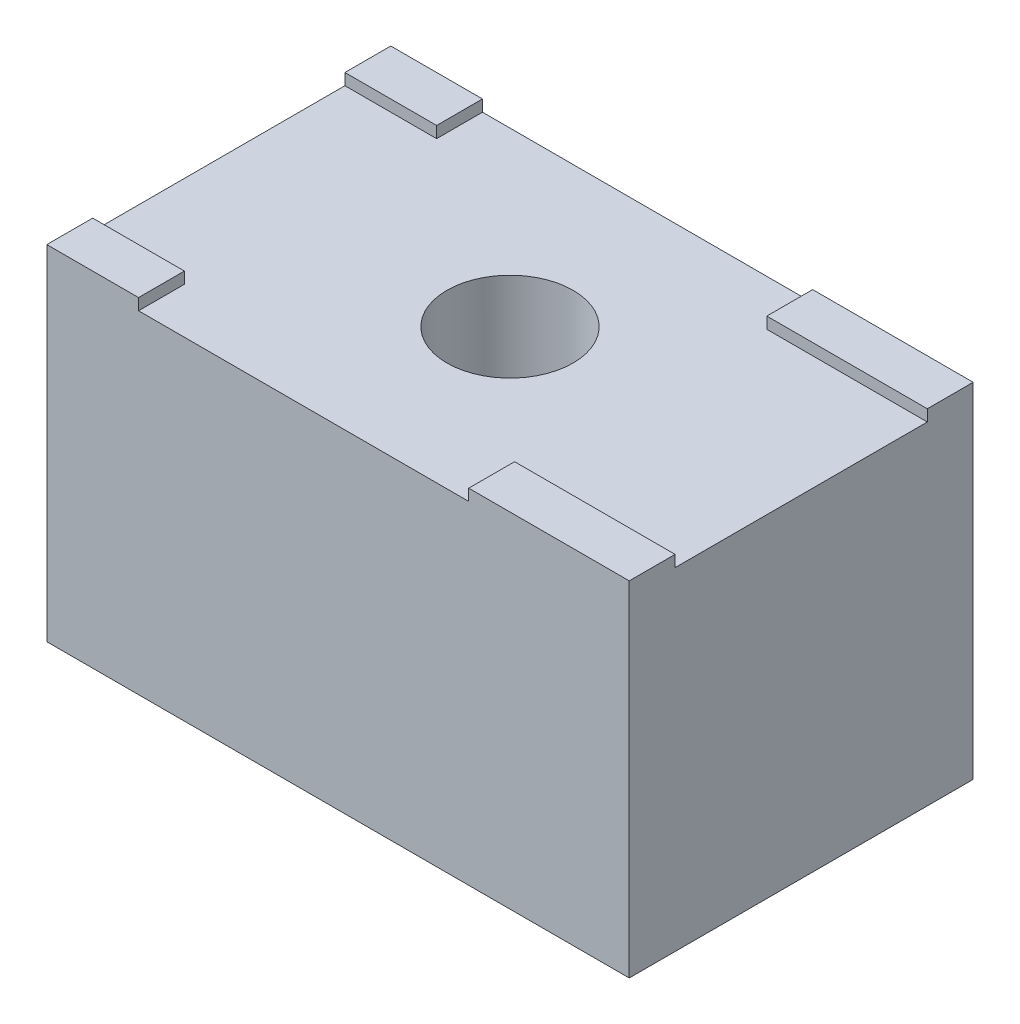
ISO-10303-21;
HEADER;
FILE_DESCRIPTION(('STEP AP214'),'2;1');
FILE_NAME('part.step','',(''),(''),'','','');
FILE_SCHEMA(('AUTOMOTIVE_DESIGN { 1 0 10303 214 1 1 1 1 }'));
ENDSEC;
DATA;
#1=APPLICATION_CONTEXT('core data for automotive mechanical design processes');
#2=APPLICATION_PROTOCOL_DEFINITION('international standard','automotive_design',2000,#1);
#3=PRODUCT_CONTEXT('',#1,'mechanical');
#4=PRODUCT('Part','Part','',(#3));
#5=PRODUCT_RELATED_PRODUCT_CATEGORY('part','',(#4));
#6=PRODUCT_DEFINITION_FORMATION('','',#4);
#7=PRODUCT_DEFINITION_CONTEXT('part definition',#1,'design');
#8=PRODUCT_DEFINITION('design','',#6,#7);
#9=PRODUCT_DEFINITION_SHAPE('','',#8);
#10=(LENGTH_UNIT() NAMED_UNIT(*) SI_UNIT(.MILLI.,.METRE.));
#11=(NAMED_UNIT(*) PLANE_ANGLE_UNIT() SI_UNIT($,.RADIAN.));
#12=(NAMED_UNIT(*) SI_UNIT($,.STERADIAN.) SOLID_ANGLE_UNIT());
#13=UNCERTAINTY_MEASURE_WITH_UNIT(LENGTH_MEASURE(1.E-05),#10,'distance_accuracy_value','');
#14=(GEOMETRIC_REPRESENTATION_CONTEXT(3) GLOBAL_UNCERTAINTY_ASSIGNED_CONTEXT((#13)) GLOBAL_UNIT_ASSIGNED_CONTEXT((#10,
#11,#12)) REPRESENTATION_CONTEXT('',''));
#15=CARTESIAN_POINT('',(0.,0.,0.));
#16=DIRECTION('',(0.,0.,1.));
#17=DIRECTION('',(1.,0.,0.));
#18=AXIS2_PLACEMENT_3D('',#15,#16,#17);
#19=CARTESIAN_POINT('',(25.4,7.5,7.5));
#20=DIRECTION('',(0.,-1.,0.));
#21=DIRECTION('',(0.,0.,-1.));
#22=AXIS2_PLACEMENT_3D('',#19,#20,#21);
#23=PLANE('',#22);
#24=DIRECTION('',(-1.,0.,0.));
#25=VECTOR('',#24,1.);
#26=CARTESIAN_POINT('',(25.4,7.5,-7.5));
#27=LINE('',#26,#25);
#28=CARTESIAN_POINT('',(25.4,7.5,-7.5));
#29=VERTEX_POINT('',#28);
#30=CARTESIAN_POINT('',(18.4,7.5,-7.5));
#31=VERTEX_POINT('',#30);
#32=EDGE_CURVE('E344',#29,#31,#27,.T.);
#33=ORIENTED_EDGE('',*,*,#32,.T.);
#34=DIRECTION('',(0.,0.,-1.));
#35=VECTOR('',#34,1.);
#36=CARTESIAN_POINT('',(18.4,7.5,-7.5));
#37=LINE('',#36,#35);
#38=CARTESIAN_POINT('',(18.4,7.5,-5.5));
#39=VERTEX_POINT('',#38);
#40=EDGE_CURVE('E208',#39,#31,#37,.T.);
#41=ORIENTED_EDGE('',*,*,#40,.F.);
#42=DIRECTION('',(-1.,0.,0.));
#43=VECTOR('',#42,1.);
#44=CARTESIAN_POINT('',(18.4,7.5,-5.5));
#45=LINE('',#44,#43);
#46=CARTESIAN_POINT('',(25.4,7.5,-5.5));
#47=VERTEX_POINT('',#46);
#48=EDGE_CURVE('E210',#47,#39,#45,.T.);
#49=ORIENTED_EDGE('',*,*,#48,.F.);
#50=DIRECTION('',(0.,0.,1.));
#51=VECTOR('',#50,1.);
#52=CARTESIAN_POINT('',(25.4,7.5,7.5));
#53=LINE('',#52,#51);
#54=EDGE_CURVE('E316',#29,#47,#53,.T.);
#55=ORIENTED_EDGE('',*,*,#54,.F.);
#56=EDGE_LOOP('',(#33,#41,#49,#55));
#57=FACE_BOUND('',#56,.T.);
#58=ADVANCED_FACE('F37',(#57),#23,.F.);
#59=CARTESIAN_POINT('',(25.4,7.5,5.5));
#60=VERTEX_POINT('',#59);
#61=CARTESIAN_POINT('',(25.4,7.5,7.5));
#62=VERTEX_POINT('',#61);
#63=EDGE_CURVE('E314',#60,#62,#53,.T.);
#64=ORIENTED_EDGE('',*,*,#63,.F.);
#65=DIRECTION('',(1.,0.,0.));
#66=VECTOR('',#65,1.);
#67=CARTESIAN_POINT('',(18.4,7.5,5.5));
#68=LINE('',#67,#66);
#69=CARTESIAN_POINT('',(18.4,7.5,5.5));
#70=VERTEX_POINT('',#69);
#71=EDGE_CURVE('E249',#70,#60,#68,.T.);
#72=ORIENTED_EDGE('',*,*,#71,.F.);
#73=DIRECTION('',(0.,0.,-1.));
#74=VECTOR('',#73,1.);
#75=CARTESIAN_POINT('',(18.4,7.5,5.5));
#76=LINE('',#75,#74);
#77=CARTESIAN_POINT('',(18.4,7.5,7.5));
#78=VERTEX_POINT('',#77);
#79=EDGE_CURVE('E246',#78,#70,#76,.T.);
#80=ORIENTED_EDGE('',*,*,#79,.F.);
#81=DIRECTION('',(-1.,0.,0.));
#82=VECTOR('',#81,1.);
#83=CARTESIAN_POINT('',(25.4,7.5,7.5));
#84=LINE('',#83,#82);
#85=EDGE_CURVE('E340',#62,#78,#84,.T.);
#86=ORIENTED_EDGE('',*,*,#85,.F.);
#87=EDGE_LOOP('',(#64,#72,#80,#86));
#88=FACE_BOUND('',#87,.T.);
#89=ADVANCED_FACE('F427',(#88),#23,.F.);
#90=CARTESIAN_POINT('',(4.,7.5,7.5));
#91=VERTEX_POINT('',#90);
#92=CARTESIAN_POINT('',(0.,7.5,7.5));
#93=VERTEX_POINT('',#92);
#94=EDGE_CURVE('E339',#91,#93,#84,.T.);
#95=ORIENTED_EDGE('',*,*,#94,.F.);
#96=DIRECTION('',(0.,0.,1.));
#97=VECTOR('',#96,1.);
#98=CARTESIAN_POINT('',(4.,7.5,5.5));
#99=LINE('',#98,#97);
#100=CARTESIAN_POINT('',(4.,7.5,5.5));
#101=VERTEX_POINT('',#100);
#102=EDGE_CURVE('E244',#101,#91,#99,.T.);
#103=ORIENTED_EDGE('',*,*,#102,.F.);
#104=DIRECTION('',(1.,0.,0.));
#105=VECTOR('',#104,1.);
#106=CARTESIAN_POINT('',(4.,7.5,5.5));
#107=LINE('',#106,#105);
#108=CARTESIAN_POINT('',(0.,7.5,5.5));
#109=VERTEX_POINT('',#108);
#110=EDGE_CURVE('E241',#109,#101,#107,.T.);
#111=ORIENTED_EDGE('',*,*,#110,.F.);
#112=DIRECTION('',(0.,0.,1.));
#113=VECTOR('',#112,1.);
#114=CARTESIAN_POINT('',(0.,7.5,7.5));
#115=LINE('',#114,#113);
#116=EDGE_CURVE('E327',#109,#93,#115,.T.);
#117=ORIENTED_EDGE('',*,*,#116,.T.);
#118=EDGE_LOOP('',(#95,#103,#111,#117));
#119=FACE_BOUND('',#118,.T.);
#120=ADVANCED_FACE('F409',(#119),#23,.F.);
#121=CARTESIAN_POINT('',(25.4,7.5,-7.5));
#122=DIRECTION('',(0.,0.,1.));
#123=DIRECTION('',(0.,-1.,0.));
#124=AXIS2_PLACEMENT_3D('',#121,#122,#123);
#125=PLANE('',#124);
#126=CARTESIAN_POINT('',(4.,7.5,-7.5));
#127=VERTEX_POINT('',#126);
#128=CARTESIAN_POINT('',(0.,7.5,-7.5));
#129=VERTEX_POINT('',#128);
#130=EDGE_CURVE('E343',#127,#129,#27,.T.);
#131=ORIENTED_EDGE('',*,*,#130,.F.);
#132=DIRECTION('',(0.,1.,0.));
#133=VECTOR('',#132,1.);
#134=CARTESIAN_POINT('',(4.,7.,-7.5));
#135=LINE('',#134,#133);
#136=CARTESIAN_POINT('',(4.,7.,-7.5));
#137=VERTEX_POINT('',#136);
#138=EDGE_CURVE('E253',#137,#127,#135,.T.);
#139=ORIENTED_EDGE('',*,*,#138,.F.);
#140=DIRECTION('',(-1.,0.,0.));
#141=VECTOR('',#140,1.);
#142=CARTESIAN_POINT('',(4.,7.,-7.5));
#143=LINE('',#142,#141);
#144=CARTESIAN_POINT('',(18.4,7.,-7.5));
#145=VERTEX_POINT('',#144);
#146=EDGE_CURVE('E196',#145,#137,#143,.T.);
#147=ORIENTED_EDGE('',*,*,#146,.F.);
#148=DIRECTION('',(0.,1.,0.));
#149=VECTOR('',#148,1.);
#150=CARTESIAN_POINT('',(18.4,7.,-7.5));
#151=LINE('',#150,#149);
#152=EDGE_CURVE('E255',#145,#31,#151,.T.);
#153=ORIENTED_EDGE('',*,*,#152,.T.);
#154=ORIENTED_EDGE('',*,*,#32,.F.);
#155=DIRECTION('',(0.,1.,0.));
#156=VECTOR('',#155,1.);
#157=CARTESIAN_POINT('',(25.4,7.5,-7.5));
#158=LINE('',#157,#156);
#159=CARTESIAN_POINT('',(25.4,-7.5,-7.5));
#160=VERTEX_POINT('',#159);
#161=EDGE_CURVE('E311',#160,#29,#158,.T.);
#162=ORIENTED_EDGE('',*,*,#161,.F.);
#163=DIRECTION('',(-1.,0.,0.));
#164=VECTOR('',#163,1.);
#165=CARTESIAN_POINT('',(25.4,-7.5,-7.5));
#166=LINE('',#165,#164);
#167=CARTESIAN_POINT('',(0.,-7.5,-7.5));
#168=VERTEX_POINT('',#167);
#169=EDGE_CURVE('E323',#160,#168,#166,.T.);
#170=ORIENTED_EDGE('',*,*,#169,.T.);
#171=DIRECTION('',(0.,1.,0.));
#172=VECTOR('',#171,1.);
#173=CARTESIAN_POINT('',(0.,7.5,-7.5));
#174=LINE('',#173,#172);
#175=CARTESIAN_POINT('',(0.,-3.358,-7.5));
#176=VERTEX_POINT('',#175);
#177=EDGE_CURVE('E324',#168,#176,#174,.T.);
#178=ORIENTED_EDGE('',*,*,#177,.T.);
#179=DIRECTION('',(-1.,0.,0.));
#180=VECTOR('',#179,1.);
#181=CARTESIAN_POINT('',(0.,-3.358,-7.5));
#182=LINE('',#181,#180);
#183=CARTESIAN_POINT('',(9.20625,-3.358,-7.5));
#184=VERTEX_POINT('',#183);
#185=EDGE_CURVE('E288',#184,#176,#182,.T.);
#186=ORIENTED_EDGE('',*,*,#185,.F.);
#187=CARTESIAN_POINT('',(9.20625,-2.56425,-7.5));
#188=DIRECTION('',(0.,0.,1.));
#189=DIRECTION('',(0.,-1.,0.));
#190=AXIS2_PLACEMENT_3D('',#187,#188,#189);
#191=CIRCLE('',#190,0.79375);
#192=CARTESIAN_POINT('',(10.,-2.56425,-7.5));
#193=VERTEX_POINT('',#192);
#194=EDGE_CURVE('E11',#184,#193,#191,.T.);
#195=ORIENTED_EDGE('',*,*,#194,.T.);
#196=DIRECTION('',(0.,-1.,0.));
#197=VECTOR('',#196,1.);
#198=CARTESIAN_POINT('',(10.,3.5,-7.5));
#199=LINE('',#198,#197);
#200=CARTESIAN_POINT('',(10.,2.70625,-7.5));
#201=VERTEX_POINT('',#200);
#202=EDGE_CURVE('E299',#201,#193,#199,.T.);
#203=ORIENTED_EDGE('',*,*,#202,.F.);
#204=CARTESIAN_POINT('',(9.20625,2.70625,-7.5));
#205=DIRECTION('',(0.,0.,1.));
#206=DIRECTION('',(0.,-1.,0.));
#207=AXIS2_PLACEMENT_3D('',#204,#205,#206);
#208=CIRCLE('',#207,0.79375);
#209=CARTESIAN_POINT('',(9.20625,3.5,-7.5));
#210=VERTEX_POINT('',#209);
#211=EDGE_CURVE('E46',#201,#210,#208,.T.);
#212=ORIENTED_EDGE('',*,*,#211,.T.);
#213=DIRECTION('',(1.,0.,0.));
#214=VECTOR('',#213,1.);
#215=CARTESIAN_POINT('',(0.,3.5,-7.5));
#216=LINE('',#215,#214);
#217=CARTESIAN_POINT('',(0.,3.5,-7.5));
#218=VERTEX_POINT('',#217);
#219=EDGE_CURVE('E280',#218,#210,#216,.T.);
#220=ORIENTED_EDGE('',*,*,#219,.F.);
#221=EDGE_CURVE('E310',#218,#129,#174,.T.);
#222=ORIENTED_EDGE('',*,*,#221,.T.);
#223=EDGE_LOOP('',(#131,#139,#147,#153,#154,#162,#170,#178,#186,#195,#203,#212,#220,#222));
#224=FACE_BOUND('',#223,.T.);
#225=ADVANCED_FACE('F364',(#224),#125,.F.);
#226=DIRECTION('',(-1.,0.,0.));
#227=VECTOR('',#226,1.);
#228=CARTESIAN_POINT('',(4.,7.5,-5.5));
#229=LINE('',#228,#227);
#230=CARTESIAN_POINT('',(4.,7.5,-5.5));
#231=VERTEX_POINT('',#230);
#232=CARTESIAN_POINT('',(0.,7.5,-5.5));
#233=VERTEX_POINT('',#232);
#234=EDGE_CURVE('E239',#231,#233,#229,.T.);
#235=ORIENTED_EDGE('',*,*,#234,.F.);
#236=DIRECTION('',(0.,0.,1.));
#237=VECTOR('',#236,1.);
#238=CARTESIAN_POINT('',(4.,7.5,-7.5));
#239=LINE('',#238,#237);
#240=EDGE_CURVE('E192',#127,#231,#239,.T.);
#241=ORIENTED_EDGE('',*,*,#240,.F.);
#242=ORIENTED_EDGE('',*,*,#130,.T.);
#243=EDGE_CURVE('E328',#129,#233,#115,.T.);
#244=ORIENTED_EDGE('',*,*,#243,.T.);
#245=EDGE_LOOP('',(#235,#241,#242,#244));
#246=FACE_BOUND('',#245,.T.);
#247=ADVANCED_FACE('F393',(#246),#23,.F.);
#248=CARTESIAN_POINT('',(25.4,7.5,7.5));
#249=DIRECTION('',(0.,0.,-1.));
#250=DIRECTION('',(0.,1.,0.));
#251=AXIS2_PLACEMENT_3D('',#248,#249,#250);
#252=PLANE('',#251);
#253=ORIENTED_EDGE('',*,*,#85,.T.);
#254=DIRECTION('',(0.,1.,0.));
#255=VECTOR('',#254,1.);
#256=CARTESIAN_POINT('',(18.4,7.,7.5));
#257=LINE('',#256,#255);
#258=CARTESIAN_POINT('',(18.4,7.,7.5));
#259=VERTEX_POINT('',#258);
#260=EDGE_CURVE('E267',#259,#78,#257,.T.);
#261=ORIENTED_EDGE('',*,*,#260,.F.);
#262=DIRECTION('',(1.,0.,0.));
#263=VECTOR('',#262,1.);
#264=CARTESIAN_POINT('',(4.,7.,7.5));
#265=LINE('',#264,#263);
#266=CARTESIAN_POINT('',(4.,7.,7.5));
#267=VERTEX_POINT('',#266);
#268=EDGE_CURVE('E220',#267,#259,#265,.T.);
#269=ORIENTED_EDGE('',*,*,#268,.F.);
#270=DIRECTION('',(0.,1.,0.));
#271=VECTOR('',#270,1.);
#272=CARTESIAN_POINT('',(4.,7.,7.5));
#273=LINE('',#272,#271);
#274=EDGE_CURVE('E269',#267,#91,#273,.T.);
#275=ORIENTED_EDGE('',*,*,#274,.T.);
#276=ORIENTED_EDGE('',*,*,#94,.T.);
#277=DIRECTION('',(0.,-1.,0.));
#278=VECTOR('',#277,1.);
#279=CARTESIAN_POINT('',(0.,7.5,7.5));
#280=LINE('',#279,#278);
#281=CARTESIAN_POINT('',(0.,-7.5,7.5));
#282=VERTEX_POINT('',#281);
#283=EDGE_CURVE('E331',#93,#282,#280,.T.);
#284=ORIENTED_EDGE('',*,*,#283,.T.);
#285=DIRECTION('',(-1.,0.,0.));
#286=VECTOR('',#285,1.);
#287=CARTESIAN_POINT('',(25.4,-7.5,7.5));
#288=LINE('',#287,#286);
#289=CARTESIAN_POINT('',(25.4,-7.5,7.5));
#290=VERTEX_POINT('',#289);
#291=EDGE_CURVE('E336',#290,#282,#288,.T.);
#292=ORIENTED_EDGE('',*,*,#291,.F.);
#293=DIRECTION('',(0.,-1.,0.));
#294=VECTOR('',#293,1.);
#295=CARTESIAN_POINT('',(25.4,7.5,7.5));
#296=LINE('',#295,#294);
#297=EDGE_CURVE('E319',#62,#290,#296,.T.);
#298=ORIENTED_EDGE('',*,*,#297,.F.);
#299=EDGE_LOOP('',(#253,#261,#269,#275,#276,#284,#292,#298));
#300=FACE_BOUND('',#299,.T.);
#301=ADVANCED_FACE('F405',(#300),#252,.F.);
#302=CARTESIAN_POINT('',(25.4,-7.5,7.5));
#303=DIRECTION('',(0.,1.,0.));
#304=DIRECTION('',(0.,0.,1.));
#305=AXIS2_PLACEMENT_3D('',#302,#303,#304);
#306=PLANE('',#305);
#307=CARTESIAN_POINT('',(12.7,-7.5,0.));
#308=DIRECTION('',(0.,1.,0.));
#309=DIRECTION('',(0.,0.,1.));
#310=AXIS2_PLACEMENT_3D('',#307,#308,#309);
#311=CIRCLE('',#310,2.75);
#312=CARTESIAN_POINT('',(12.7,-7.5,2.75));
#313=VERTEX_POINT('',#312);
#314=EDGE_CURVE('E306',#313,#313,#311,.T.);
#315=ORIENTED_EDGE('',*,*,#314,.T.);
#316=EDGE_LOOP('',(#315));
#317=FACE_BOUND('',#316,.T.);
#318=DIRECTION('',(0.,0.,-1.));
#319=VECTOR('',#318,1.);
#320=CARTESIAN_POINT('',(0.,-7.5,7.5));
#321=LINE('',#320,#319);
#322=EDGE_CURVE('E315',#282,#168,#321,.T.);
#323=ORIENTED_EDGE('',*,*,#322,.T.);
#324=ORIENTED_EDGE('',*,*,#169,.F.);
#325=DIRECTION('',(0.,0.,-1.));
#326=VECTOR('',#325,1.);
#327=CARTESIAN_POINT('',(25.4,-7.5,7.5));
#328=LINE('',#327,#326);
#329=EDGE_CURVE('E321',#290,#160,#328,.T.);
#330=ORIENTED_EDGE('',*,*,#329,.F.);
#331=ORIENTED_EDGE('',*,*,#291,.T.);
#332=EDGE_LOOP('',(#323,#324,#330,#331));
#333=FACE_BOUND('',#332,.T.);
#334=ADVANCED_FACE('F416',(#317,#333),#306,.F.);
#335=CARTESIAN_POINT('',(25.4,0.,0.));
#336=DIRECTION('',(1.,0.,0.));
#337=DIRECTION('',(0.,0.,-1.));
#338=AXIS2_PLACEMENT_3D('',#335,#336,#337);
#339=PLANE('',#338);
#340=DIRECTION('',(0.,1.,0.));
#341=VECTOR('',#340,1.);
#342=CARTESIAN_POINT('',(25.4,7.,-5.5));
#343=LINE('',#342,#341);
#344=CARTESIAN_POINT('',(25.4,7.,-5.5));
#345=VERTEX_POINT('',#344);
#346=EDGE_CURVE('E260',#345,#47,#343,.T.);
#347=ORIENTED_EDGE('',*,*,#346,.F.);
#348=DIRECTION('',(0.,0.,-1.));
#349=VECTOR('',#348,1.);
#350=CARTESIAN_POINT('',(25.4,7.,-5.5));
#351=LINE('',#350,#349);
#352=CARTESIAN_POINT('',(25.4,7.,5.5));
#353=VERTEX_POINT('',#352);
#354=EDGE_CURVE('E229',#353,#345,#351,.T.);
#355=ORIENTED_EDGE('',*,*,#354,.F.);
#356=DIRECTION('',(0.,1.,0.));
#357=VECTOR('',#356,1.);
#358=CARTESIAN_POINT('',(25.4,7.,5.5));
#359=LINE('',#358,#357);
#360=EDGE_CURVE('E262',#353,#60,#359,.T.);
#361=ORIENTED_EDGE('',*,*,#360,.T.);
#362=ORIENTED_EDGE('',*,*,#63,.T.);
#363=ORIENTED_EDGE('',*,*,#297,.T.);
#364=ORIENTED_EDGE('',*,*,#329,.T.);
#365=ORIENTED_EDGE('',*,*,#161,.T.);
#366=ORIENTED_EDGE('',*,*,#54,.T.);
#367=EDGE_LOOP('',(#347,#355,#361,#362,#363,#364,#365,#366));
#368=FACE_BOUND('',#367,.T.);
#369=ADVANCED_FACE('F421',(#368),#339,.T.);
#370=CARTESIAN_POINT('',(0.,0.,0.));
#371=DIRECTION('',(1.,0.,0.));
#372=DIRECTION('',(0.,0.,-1.));
#373=AXIS2_PLACEMENT_3D('',#370,#371,#372);
#374=PLANE('',#373);
#375=ORIENTED_EDGE('',*,*,#116,.F.);
#376=DIRECTION('',(0.,1.,0.));
#377=VECTOR('',#376,1.);
#378=CARTESIAN_POINT('',(0.,7.,5.5));
#379=LINE('',#378,#377);
#380=CARTESIAN_POINT('',(0.,7.,5.5));
#381=VERTEX_POINT('',#380);
#382=EDGE_CURVE('E274',#381,#109,#379,.T.);
#383=ORIENTED_EDGE('',*,*,#382,.F.);
#384=DIRECTION('',(0.,0.,1.));
#385=VECTOR('',#384,1.);
#386=CARTESIAN_POINT('',(0.,7.,-5.5));
#387=LINE('',#386,#385);
#388=CARTESIAN_POINT('',(0.,7.,-5.5));
#389=VERTEX_POINT('',#388);
#390=EDGE_CURVE('E201',#389,#381,#387,.T.);
#391=ORIENTED_EDGE('',*,*,#390,.F.);
#392=DIRECTION('',(0.,1.,0.));
#393=VECTOR('',#392,1.);
#394=CARTESIAN_POINT('',(0.,7.,-5.5));
#395=LINE('',#394,#393);
#396=EDGE_CURVE('E195',#389,#233,#395,.T.);
#397=ORIENTED_EDGE('',*,*,#396,.T.);
#398=ORIENTED_EDGE('',*,*,#243,.F.);
#399=ORIENTED_EDGE('',*,*,#221,.F.);
#400=DIRECTION('',(0.,0.,-1.));
#401=VECTOR('',#400,1.);
#402=CARTESIAN_POINT('',(0.,3.5,-5.722));
#403=LINE('',#402,#401);
#404=CARTESIAN_POINT('',(0.,3.5,-5.722));
#405=VERTEX_POINT('',#404);
#406=EDGE_CURVE('E296',#405,#218,#403,.T.);
#407=ORIENTED_EDGE('',*,*,#406,.F.);
#408=DIRECTION('',(0.,1.,0.));
#409=VECTOR('',#408,1.);
#410=CARTESIAN_POINT('',(0.,3.5,-5.722));
#411=LINE('',#410,#409);
#412=CARTESIAN_POINT('',(0.,-3.358,-5.722));
#413=VERTEX_POINT('',#412);
#414=EDGE_CURVE('E284',#413,#405,#411,.T.);
#415=ORIENTED_EDGE('',*,*,#414,.F.);
#416=DIRECTION('',(0.,0.,-1.));
#417=VECTOR('',#416,1.);
#418=CARTESIAN_POINT('',(0.,-3.358,-5.722));
#419=LINE('',#418,#417);
#420=EDGE_CURVE('E303',#413,#176,#419,.T.);
#421=ORIENTED_EDGE('',*,*,#420,.T.);
#422=ORIENTED_EDGE('',*,*,#177,.F.);
#423=ORIENTED_EDGE('',*,*,#322,.F.);
#424=ORIENTED_EDGE('',*,*,#283,.F.);
#425=EDGE_LOOP('',(#375,#383,#391,#397,#398,#399,#407,#415,#421,#422,#423,#424));
#426=FACE_BOUND('',#425,.T.);
#427=ADVANCED_FACE('F390',(#426),#374,.F.);
#428=CARTESIAN_POINT('',(12.7,-7.5,0.));
#429=DIRECTION('',(0.,1.,0.));
#430=DIRECTION('',(0.,0.,1.));
#431=AXIS2_PLACEMENT_3D('',#428,#429,#430);
#432=CYLINDRICAL_SURFACE('',#431,2.75);
#433=CARTESIAN_POINT('',(12.7,7.,0.));
#434=DIRECTION('',(0.,-1.,0.));
#435=DIRECTION('',(0.,0.,-1.));
#436=AXIS2_PLACEMENT_3D('',#433,#434,#435);
#437=CIRCLE('',#436,2.75);
#438=CARTESIAN_POINT('',(12.7,7.,-2.75));
#439=VERTEX_POINT('',#438);
#440=EDGE_CURVE('E41',#439,#439,#437,.F.);
#441=ORIENTED_EDGE('',*,*,#440,.T.);
#442=EDGE_LOOP('',(#441));
#443=FACE_BOUND('',#442,.T.);
#444=ORIENTED_EDGE('',*,*,#314,.F.);
#445=EDGE_LOOP('',(#444));
#446=FACE_BOUND('',#445,.T.);
#447=ADVANCED_FACE('F503',(#443,#446),#432,.F.);
#448=CARTESIAN_POINT('',(0.,-3.358,-5.722));
#449=DIRECTION('',(0.,-1.,0.));
#450=DIRECTION('',(0.,0.,-1.));
#451=AXIS2_PLACEMENT_3D('',#448,#449,#450);
#452=PLANE('',#451);
#453=DIRECTION('',(-1.,0.,0.));
#454=VECTOR('',#453,1.);
#455=CARTESIAN_POINT('',(0.,-3.358,-5.722));
#456=LINE('',#455,#454);
#457=CARTESIAN_POINT('',(9.20625,-3.358,-5.722));
#458=VERTEX_POINT('',#457);
#459=EDGE_CURVE('E294',#458,#413,#456,.T.);
#460=ORIENTED_EDGE('',*,*,#459,.F.);
#461=DIRECTION('',(0.,0.,-1.));
#462=VECTOR('',#461,1.);
#463=CARTESIAN_POINT('',(9.20625,-3.358,-7.5));
#464=LINE('',#463,#462);
#465=EDGE_CURVE('E358',#458,#184,#464,.T.);
#466=ORIENTED_EDGE('',*,*,#465,.T.);
#467=ORIENTED_EDGE('',*,*,#185,.T.);
#468=ORIENTED_EDGE('',*,*,#420,.F.);
#469=EDGE_LOOP('',(#460,#466,#467,#468));
#470=FACE_BOUND('',#469,.T.);
#471=ADVANCED_FACE('F384',(#470),#452,.F.);
#472=CARTESIAN_POINT('',(10.,3.5,-5.722));
#473=DIRECTION('',(1.,0.,0.));
#474=DIRECTION('',(0.,1.,0.));
#475=AXIS2_PLACEMENT_3D('',#472,#473,#474);
#476=PLANE('',#475);
#477=DIRECTION('',(0.,-1.,0.));
#478=VECTOR('',#477,1.);
#479=CARTESIAN_POINT('',(10.,3.5,-5.722));
#480=LINE('',#479,#478);
#481=CARTESIAN_POINT('',(10.,2.70625,-5.722));
#482=VERTEX_POINT('',#481);
#483=CARTESIAN_POINT('',(10.,-2.56425,-5.722));
#484=VERTEX_POINT('',#483);
#485=EDGE_CURVE('E291',#482,#484,#480,.T.);
#486=ORIENTED_EDGE('',*,*,#485,.F.);
#487=DIRECTION('',(0.,0.,-1.));
#488=VECTOR('',#487,1.);
#489=CARTESIAN_POINT('',(10.,2.70625,-7.5));
#490=LINE('',#489,#488);
#491=EDGE_CURVE('E349',#482,#201,#490,.T.);
#492=ORIENTED_EDGE('',*,*,#491,.T.);
#493=ORIENTED_EDGE('',*,*,#202,.T.);
#494=DIRECTION('',(0.,0.,-1.));
#495=VECTOR('',#494,1.);
#496=CARTESIAN_POINT('',(10.,-2.56425,-5.722));
#497=LINE('',#496,#495);
#498=EDGE_CURVE('E347',#193,#484,#497,.F.);
#499=ORIENTED_EDGE('',*,*,#498,.T.);
#500=EDGE_LOOP('',(#486,#492,#493,#499));
#501=FACE_BOUND('',#500,.T.);
#502=ADVANCED_FACE('F380',(#501),#476,.F.);
#503=CARTESIAN_POINT('',(0.,3.5,-5.722));
#504=DIRECTION('',(0.,1.,0.));
#505=DIRECTION('',(0.,0.,1.));
#506=AXIS2_PLACEMENT_3D('',#503,#504,#505);
#507=PLANE('',#506);
#508=ORIENTED_EDGE('',*,*,#219,.T.);
#509=DIRECTION('',(0.,0.,-1.));
#510=VECTOR('',#509,1.);
#511=CARTESIAN_POINT('',(9.20625,3.5,-5.722));
#512=LINE('',#511,#510);
#513=CARTESIAN_POINT('',(9.20625,3.5,-5.722));
#514=VERTEX_POINT('',#513);
#515=EDGE_CURVE('E352',#210,#514,#512,.F.);
#516=ORIENTED_EDGE('',*,*,#515,.T.);
#517=DIRECTION('',(1.,0.,0.));
#518=VECTOR('',#517,1.);
#519=CARTESIAN_POINT('',(0.,3.5,-5.722));
#520=LINE('',#519,#518);
#521=EDGE_CURVE('E287',#405,#514,#520,.T.);
#522=ORIENTED_EDGE('',*,*,#521,.F.);
#523=ORIENTED_EDGE('',*,*,#406,.T.);
#524=EDGE_LOOP('',(#508,#516,#522,#523));
#525=FACE_BOUND('',#524,.T.);
#526=ADVANCED_FACE('F371',(#525),#507,.F.);
#527=CARTESIAN_POINT('',(0.,0.,-5.722));
#528=DIRECTION('',(0.,0.,1.));
#529=DIRECTION('',(0.,-1.,0.));
#530=AXIS2_PLACEMENT_3D('',#527,#528,#529);
#531=PLANE('',#530);
#532=CARTESIAN_POINT('',(4.92,0.0709999999999987,-5.722));
#533=DIRECTION('',(0.,0.,-1.));
#534=DIRECTION('',(0.,1.,0.));
#535=AXIS2_PLACEMENT_3D('',#532,#533,#534);
#536=CIRCLE('',#535,1.5875);
#537=CARTESIAN_POINT('',(4.92,1.6585,-5.722));
#538=VERTEX_POINT('',#537);
#539=EDGE_CURVE('E277',#538,#538,#536,.T.);
#540=ORIENTED_EDGE('',*,*,#539,.F.);
#541=EDGE_LOOP('',(#540));
#542=FACE_BOUND('',#541,.T.);
#543=ORIENTED_EDGE('',*,*,#521,.T.);
#544=CARTESIAN_POINT('',(9.20625,2.70625,-5.722));
#545=DIRECTION('',(0.,0.,1.));
#546=DIRECTION('',(0.,-1.,0.));
#547=AXIS2_PLACEMENT_3D('',#544,#545,#546);
#548=CIRCLE('',#547,0.79375);
#549=EDGE_CURVE('E356',#514,#482,#548,.F.);
#550=ORIENTED_EDGE('',*,*,#549,.T.);
#551=ORIENTED_EDGE('',*,*,#485,.T.);
#552=CARTESIAN_POINT('',(9.20625,-2.56425,-5.722));
#553=DIRECTION('',(0.,0.,1.));
#554=DIRECTION('',(0.,-1.,0.));
#555=AXIS2_PLACEMENT_3D('',#552,#553,#554);
#556=CIRCLE('',#555,0.79375);
#557=EDGE_CURVE('E354',#484,#458,#556,.F.);
#558=ORIENTED_EDGE('',*,*,#557,.T.);
#559=ORIENTED_EDGE('',*,*,#459,.T.);
#560=ORIENTED_EDGE('',*,*,#414,.T.);
#561=EDGE_LOOP('',(#543,#550,#551,#558,#559,#560));
#562=FACE_BOUND('',#561,.T.);
#563=ADVANCED_FACE('F377',(#542,#562),#531,.F.);
#564=CARTESIAN_POINT('',(4.92,0.0709999999999987,-5.722));
#565=DIRECTION('',(0.,0.,-1.));
#566=DIRECTION('',(0.,1.,0.));
#567=AXIS2_PLACEMENT_3D('',#564,#565,#566);
#568=CYLINDRICAL_SURFACE('',#567,1.5875);
#569=ORIENTED_EDGE('',*,*,#539,.T.);
#570=EDGE_LOOP('',(#569));
#571=FACE_BOUND('',#570,.T.);
#572=CARTESIAN_POINT('',(4.92,0.070999999999999,-7.5));
#573=DIRECTION('',(0.,0.,-1.));
#574=DIRECTION('',(0.,1.,0.));
#575=AXIS2_PLACEMENT_3D('',#572,#573,#574);
#576=CIRCLE('',#575,1.5875);
#577=CARTESIAN_POINT('',(4.92,1.6585,-7.5));
#578=VERTEX_POINT('',#577);
#579=EDGE_CURVE('E281',#578,#578,#576,.T.);
#580=ORIENTED_EDGE('',*,*,#579,.F.);
#581=EDGE_LOOP('',(#580));
#582=FACE_BOUND('',#581,.T.);
#583=ADVANCED_FACE('F583',(#571,#582),#568,.T.);
#584=ORIENTED_EDGE('',*,*,#579,.T.);
#585=EDGE_LOOP('',(#584));
#586=FACE_BOUND('',#585,.T.);
#587=ADVANCED_FACE('F464',(#586),#125,.F.);
#588=CARTESIAN_POINT('',(9.20625,2.70625,-5.722));
#589=DIRECTION('',(0.,0.,1.));
#590=DIRECTION('',(0.,-1.,0.));
#591=AXIS2_PLACEMENT_3D('',#588,#589,#590);
#592=CYLINDRICAL_SURFACE('',#591,0.79375);
#593=ORIENTED_EDGE('',*,*,#549,.F.);
#594=ORIENTED_EDGE('',*,*,#515,.F.);
#595=ORIENTED_EDGE('',*,*,#211,.F.);
#596=ORIENTED_EDGE('',*,*,#491,.F.);
#597=EDGE_LOOP('',(#593,#594,#595,#596));
#598=FACE_BOUND('',#597,.T.);
#599=ADVANCED_FACE('F374',(#598),#592,.F.);
#600=CARTESIAN_POINT('',(9.20625,-2.56425,-5.722));
#601=DIRECTION('',(0.,0.,1.));
#602=DIRECTION('',(0.,-1.,0.));
#603=AXIS2_PLACEMENT_3D('',#600,#601,#602);
#604=CYLINDRICAL_SURFACE('',#603,0.79375);
#605=ORIENTED_EDGE('',*,*,#557,.F.);
#606=ORIENTED_EDGE('',*,*,#498,.F.);
#607=ORIENTED_EDGE('',*,*,#194,.F.);
#608=ORIENTED_EDGE('',*,*,#465,.F.);
#609=EDGE_LOOP('',(#605,#606,#607,#608));
#610=FACE_BOUND('',#609,.T.);
#611=ADVANCED_FACE('F39',(#610),#604,.F.);
#612=CARTESIAN_POINT('',(0.,7.,0.));
#613=DIRECTION('',(0.,-1.,0.));
#614=DIRECTION('',(0.,0.,-1.));
#615=AXIS2_PLACEMENT_3D('',#612,#613,#614);
#616=PLANE('',#615);
#617=DIRECTION('',(0.,0.,1.));
#618=VECTOR('',#617,1.);
#619=CARTESIAN_POINT('',(4.,7.,-7.5));
#620=LINE('',#619,#618);
#621=CARTESIAN_POINT('',(4.,7.,-5.5));
#622=VERTEX_POINT('',#621);
#623=EDGE_CURVE('E189',#137,#622,#620,.T.);
#624=ORIENTED_EDGE('',*,*,#623,.T.);
#625=DIRECTION('',(-1.,0.,0.));
#626=VECTOR('',#625,1.);
#627=CARTESIAN_POINT('',(4.,7.,-5.5));
#628=LINE('',#627,#626);
#629=EDGE_CURVE('E53',#622,#389,#628,.T.);
#630=ORIENTED_EDGE('',*,*,#629,.T.);
#631=ORIENTED_EDGE('',*,*,#390,.T.);
#632=DIRECTION('',(1.,0.,0.));
#633=VECTOR('',#632,1.);
#634=CARTESIAN_POINT('',(4.,7.,5.5));
#635=LINE('',#634,#633);
#636=CARTESIAN_POINT('',(4.,7.,5.5));
#637=VERTEX_POINT('',#636);
#638=EDGE_CURVE('E214',#381,#637,#635,.T.);
#639=ORIENTED_EDGE('',*,*,#638,.T.);
#640=DIRECTION('',(0.,0.,1.));
#641=VECTOR('',#640,1.);
#642=CARTESIAN_POINT('',(4.,7.,5.5));
#643=LINE('',#642,#641);
#644=EDGE_CURVE('E217',#637,#267,#643,.T.);
#645=ORIENTED_EDGE('',*,*,#644,.T.);
#646=ORIENTED_EDGE('',*,*,#268,.T.);
#647=DIRECTION('',(0.,0.,-1.));
#648=VECTOR('',#647,1.);
#649=CARTESIAN_POINT('',(18.4,7.,5.5));
#650=LINE('',#649,#648);
#651=CARTESIAN_POINT('',(18.4,7.,5.5));
#652=VERTEX_POINT('',#651);
#653=EDGE_CURVE('E223',#259,#652,#650,.T.);
#654=ORIENTED_EDGE('',*,*,#653,.T.);
#655=DIRECTION('',(1.,0.,0.));
#656=VECTOR('',#655,1.);
#657=CARTESIAN_POINT('',(18.4,7.,5.5));
#658=LINE('',#657,#656);
#659=EDGE_CURVE('E226',#652,#353,#658,.T.);
#660=ORIENTED_EDGE('',*,*,#659,.T.);
#661=ORIENTED_EDGE('',*,*,#354,.T.);
#662=DIRECTION('',(-1.,0.,0.));
#663=VECTOR('',#662,1.);
#664=CARTESIAN_POINT('',(18.4,7.,-5.5));
#665=LINE('',#664,#663);
#666=CARTESIAN_POINT('',(18.4,7.,-5.5));
#667=VERTEX_POINT('',#666);
#668=EDGE_CURVE('E232',#345,#667,#665,.T.);
#669=ORIENTED_EDGE('',*,*,#668,.T.);
#670=DIRECTION('',(0.,0.,-1.));
#671=VECTOR('',#670,1.);
#672=CARTESIAN_POINT('',(18.4,7.,-7.5));
#673=LINE('',#672,#671);
#674=EDGE_CURVE('E235',#667,#145,#673,.T.);
#675=ORIENTED_EDGE('',*,*,#674,.T.);
#676=ORIENTED_EDGE('',*,*,#146,.T.);
#677=EDGE_LOOP('',(#624,#630,#631,#639,#645,#646,#654,#660,#661,#669,#675,#676));
#678=FACE_BOUND('',#677,.T.);
#679=ORIENTED_EDGE('',*,*,#440,.F.);
#680=EDGE_LOOP('',(#679));
#681=FACE_BOUND('',#680,.T.);
#682=ADVANCED_FACE('F203',(#678,#681),#616,.F.);
#683=CARTESIAN_POINT('',(4.,7.,-7.5));
#684=DIRECTION('',(-1.,0.,0.));
#685=DIRECTION('',(0.,0.,1.));
#686=AXIS2_PLACEMENT_3D('',#683,#684,#685);
#687=PLANE('',#686);
#688=ORIENTED_EDGE('',*,*,#240,.T.);
#689=DIRECTION('',(0.,1.,0.));
#690=VECTOR('',#689,1.);
#691=CARTESIAN_POINT('',(4.,7.,-5.5));
#692=LINE('',#691,#690);
#693=EDGE_CURVE('E187',#622,#231,#692,.T.);
#694=ORIENTED_EDGE('',*,*,#693,.F.);
#695=ORIENTED_EDGE('',*,*,#623,.F.);
#696=ORIENTED_EDGE('',*,*,#138,.T.);
#697=EDGE_LOOP('',(#688,#694,#695,#696));
#698=FACE_BOUND('',#697,.T.);
#699=ADVANCED_FACE('F188',(#698),#687,.F.);
#700=CARTESIAN_POINT('',(18.4,7.,-7.5));
#701=DIRECTION('',(1.,0.,0.));
#702=DIRECTION('',(0.,0.,-1.));
#703=AXIS2_PLACEMENT_3D('',#700,#701,#702);
#704=PLANE('',#703);
#705=ORIENTED_EDGE('',*,*,#40,.T.);
#706=ORIENTED_EDGE('',*,*,#152,.F.);
#707=ORIENTED_EDGE('',*,*,#674,.F.);
#708=DIRECTION('',(0.,1.,0.));
#709=VECTOR('',#708,1.);
#710=CARTESIAN_POINT('',(18.4,7.,-5.5));
#711=LINE('',#710,#709);
#712=EDGE_CURVE('E258',#667,#39,#711,.T.);
#713=ORIENTED_EDGE('',*,*,#712,.T.);
#714=EDGE_LOOP('',(#705,#706,#707,#713));
#715=FACE_BOUND('',#714,.T.);
#716=ADVANCED_FACE('F440',(#715),#704,.F.);
#717=CARTESIAN_POINT('',(18.4,7.,-5.5));
#718=DIRECTION('',(0.,0.,-1.));
#719=DIRECTION('',(-1.,0.,0.));
#720=AXIS2_PLACEMENT_3D('',#717,#718,#719);
#721=PLANE('',#720);
#722=ORIENTED_EDGE('',*,*,#48,.T.);
#723=ORIENTED_EDGE('',*,*,#712,.F.);
#724=ORIENTED_EDGE('',*,*,#668,.F.);
#725=ORIENTED_EDGE('',*,*,#346,.T.);
#726=EDGE_LOOP('',(#722,#723,#724,#725));
#727=FACE_BOUND('',#726,.T.);
#728=ADVANCED_FACE('F436',(#727),#721,.F.);
#729=CARTESIAN_POINT('',(18.4,7.,5.5));
#730=DIRECTION('',(0.,0.,1.));
#731=DIRECTION('',(1.,0.,0.));
#732=AXIS2_PLACEMENT_3D('',#729,#730,#731);
#733=PLANE('',#732);
#734=ORIENTED_EDGE('',*,*,#71,.T.);
#735=ORIENTED_EDGE('',*,*,#360,.F.);
#736=ORIENTED_EDGE('',*,*,#659,.F.);
#737=DIRECTION('',(0.,1.,0.));
#738=VECTOR('',#737,1.);
#739=CARTESIAN_POINT('',(18.4,7.,5.5));
#740=LINE('',#739,#738);
#741=EDGE_CURVE('E265',#652,#70,#740,.T.);
#742=ORIENTED_EDGE('',*,*,#741,.T.);
#743=EDGE_LOOP('',(#734,#735,#736,#742));
#744=FACE_BOUND('',#743,.T.);
#745=ADVANCED_FACE('F448',(#744),#733,.F.);
#746=CARTESIAN_POINT('',(18.4,7.,5.5));
#747=DIRECTION('',(1.,0.,0.));
#748=DIRECTION('',(0.,0.,-1.));
#749=AXIS2_PLACEMENT_3D('',#746,#747,#748);
#750=PLANE('',#749);
#751=ORIENTED_EDGE('',*,*,#79,.T.);
#752=ORIENTED_EDGE('',*,*,#741,.F.);
#753=ORIENTED_EDGE('',*,*,#653,.F.);
#754=ORIENTED_EDGE('',*,*,#260,.T.);
#755=EDGE_LOOP('',(#751,#752,#753,#754));
#756=FACE_BOUND('',#755,.T.);
#757=ADVANCED_FACE('F430',(#756),#750,.F.);
#758=CARTESIAN_POINT('',(4.,7.,5.5));
#759=DIRECTION('',(-1.,0.,0.));
#760=DIRECTION('',(0.,0.,1.));
#761=AXIS2_PLACEMENT_3D('',#758,#759,#760);
#762=PLANE('',#761);
#763=ORIENTED_EDGE('',*,*,#102,.T.);
#764=ORIENTED_EDGE('',*,*,#274,.F.);
#765=ORIENTED_EDGE('',*,*,#644,.F.);
#766=DIRECTION('',(0.,1.,0.));
#767=VECTOR('',#766,1.);
#768=CARTESIAN_POINT('',(4.,7.,5.5));
#769=LINE('',#768,#767);
#770=EDGE_CURVE('E272',#637,#101,#769,.T.);
#771=ORIENTED_EDGE('',*,*,#770,.T.);
#772=EDGE_LOOP('',(#763,#764,#765,#771));
#773=FACE_BOUND('',#772,.T.);
#774=ADVANCED_FACE('F402',(#773),#762,.F.);
#775=CARTESIAN_POINT('',(4.,7.,5.5));
#776=DIRECTION('',(0.,0.,1.));
#777=DIRECTION('',(1.,0.,0.));
#778=AXIS2_PLACEMENT_3D('',#775,#776,#777);
#779=PLANE('',#778);
#780=ORIENTED_EDGE('',*,*,#110,.T.);
#781=ORIENTED_EDGE('',*,*,#770,.F.);
#782=ORIENTED_EDGE('',*,*,#638,.F.);
#783=ORIENTED_EDGE('',*,*,#382,.T.);
#784=EDGE_LOOP('',(#780,#781,#782,#783));
#785=FACE_BOUND('',#784,.T.);
#786=ADVANCED_FACE('F398',(#785),#779,.F.);
#787=CARTESIAN_POINT('',(4.,7.,-5.5));
#788=DIRECTION('',(0.,0.,-1.));
#789=DIRECTION('',(-1.,0.,0.));
#790=AXIS2_PLACEMENT_3D('',#787,#788,#789);
#791=PLANE('',#790);
#792=ORIENTED_EDGE('',*,*,#234,.T.);
#793=ORIENTED_EDGE('',*,*,#396,.F.);
#794=ORIENTED_EDGE('',*,*,#629,.F.);
#795=ORIENTED_EDGE('',*,*,#693,.T.);
#796=EDGE_LOOP('',(#792,#793,#794,#795));
#797=FACE_BOUND('',#796,.T.);
#798=ADVANCED_FACE('F198',(#797),#791,.F.);
#799=CLOSED_SHELL('',(#58,#89,#120,#225,#247,#301,#334,#369,#427,#447,#471,#502,#526,#563,#583,
#587,#599,#611,#682,#699,#716,#728,#745,#757,#774,#786,#798));
#800=MANIFOLD_SOLID_BREP('B2',#799);
#801=ADVANCED_BREP_SHAPE_REPRESENTATION('',(#18,#800),#14);
#802=SHAPE_DEFINITION_REPRESENTATION(#9,#801);
ENDSEC;
END-ISO-10303-21;
